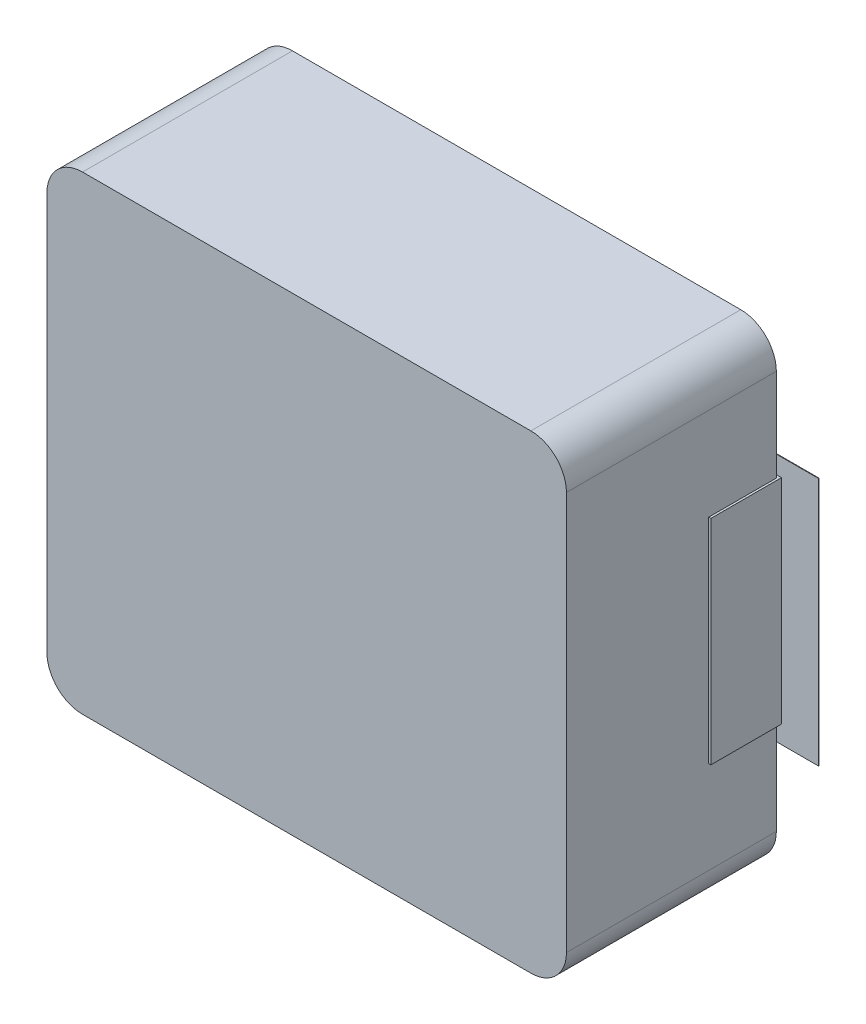
ISO-10303-21;
HEADER;
FILE_DESCRIPTION(('STEP AP214'),'2;1');
FILE_NAME('part.step','',(''),(''),'','','');
FILE_SCHEMA(('AUTOMOTIVE_DESIGN { 1 0 10303 214 1 1 1 1 }'));
ENDSEC;
DATA;
#1=APPLICATION_CONTEXT('core data for automotive mechanical design processes');
#2=APPLICATION_PROTOCOL_DEFINITION('international standard','automotive_design',2000,#1);
#3=PRODUCT_CONTEXT('',#1,'mechanical');
#4=PRODUCT('Part','Part','',(#3));
#5=PRODUCT_RELATED_PRODUCT_CATEGORY('part','',(#4));
#6=PRODUCT_DEFINITION_FORMATION('','',#4);
#7=PRODUCT_DEFINITION_CONTEXT('part definition',#1,'design');
#8=PRODUCT_DEFINITION('design','',#6,#7);
#9=PRODUCT_DEFINITION_SHAPE('','',#8);
#10=(LENGTH_UNIT() NAMED_UNIT(*) SI_UNIT(.MILLI.,.METRE.));
#11=(NAMED_UNIT(*) PLANE_ANGLE_UNIT() SI_UNIT($,.RADIAN.));
#12=(NAMED_UNIT(*) SI_UNIT($,.STERADIAN.) SOLID_ANGLE_UNIT());
#13=UNCERTAINTY_MEASURE_WITH_UNIT(LENGTH_MEASURE(1.E-05),#10,'distance_accuracy_value','');
#14=(GEOMETRIC_REPRESENTATION_CONTEXT(3) GLOBAL_UNCERTAINTY_ASSIGNED_CONTEXT((#13)) GLOBAL_UNIT_ASSIGNED_CONTEXT((#10,
#11,#12)) REPRESENTATION_CONTEXT('',''));
#15=CARTESIAN_POINT('',(0.,0.,0.));
#16=DIRECTION('',(0.,0.,1.));
#17=DIRECTION('',(1.,0.,0.));
#18=AXIS2_PLACEMENT_3D('',#15,#16,#17);
#19=CARTESIAN_POINT('',(0.,0.,0.0762));
#20=DIRECTION('',(0.,0.,1.));
#21=DIRECTION('',(1.,0.,0.));
#22=AXIS2_PLACEMENT_3D('',#19,#20,#21);
#23=PLANE('',#22);
#24=DIRECTION('',(1.,0.,0.));
#25=VECTOR('',#24,1.);
#26=CARTESIAN_POINT('',(-1.25000000000008,1.75000000000011,0.0762));
#27=LINE('',#26,#25);
#28=CARTESIAN_POINT('',(-1.25000000000008,1.75000000000011,0.0762));
#29=VERTEX_POINT('',#28);
#30=CARTESIAN_POINT('',(-4.20000000000098,1.75000000000011,0.0762));
#31=VERTEX_POINT('',#30);
#32=EDGE_CURVE('E199',#29,#31,#27,.F.);
#33=ORIENTED_EDGE('',*,*,#32,.F.);
#34=DIRECTION('',(0.,1.,0.));
#35=VECTOR('',#34,1.);
#36=CARTESIAN_POINT('',(-1.25000000000008,-1.75000000000011,0.0762));
#37=LINE('',#36,#35);
#38=CARTESIAN_POINT('',(-1.25000000000008,-1.75000000000011,0.0762));
#39=VERTEX_POINT('',#38);
#40=EDGE_CURVE('E204',#39,#29,#37,.T.);
#41=ORIENTED_EDGE('',*,*,#40,.F.);
#42=DIRECTION('',(1.,0.,0.));
#43=VECTOR('',#42,1.);
#44=CARTESIAN_POINT('',(-4.20000000000098,-1.75000000000011,0.0762));
#45=LINE('',#44,#43);
#46=CARTESIAN_POINT('',(-4.20000000000098,-1.75000000000011,0.0762));
#47=VERTEX_POINT('',#46);
#48=EDGE_CURVE('E296',#47,#39,#45,.T.);
#49=ORIENTED_EDGE('',*,*,#48,.F.);
#50=DIRECTION('',(0.,1.,0.));
#51=VECTOR('',#50,1.);
#52=CARTESIAN_POINT('',(-4.20000000000098,1.75000000000011,0.0762));
#53=LINE('',#52,#51);
#54=EDGE_CURVE('E214',#31,#47,#53,.F.);
#55=ORIENTED_EDGE('',*,*,#54,.F.);
#56=EDGE_LOOP('',(#33,#41,#49,#55));
#57=FACE_BOUND('',#56,.T.);
#58=ADVANCED_FACE('F17',(#57),#23,.F.);
#59=CARTESIAN_POINT('',(0.,0.,0.0762));
#60=DIRECTION('',(0.,0.,1.));
#61=DIRECTION('',(1.,0.,0.));
#62=AXIS2_PLACEMENT_3D('',#59,#60,#61);
#63=PLANE('',#62);
#64=DIRECTION('',(1.,0.,0.));
#65=VECTOR('',#64,1.);
#66=CARTESIAN_POINT('',(4.20000000000098,1.75000000000011,0.0762));
#67=LINE('',#66,#65);
#68=CARTESIAN_POINT('',(4.20000000000098,1.75000000000011,0.0762));
#69=VERTEX_POINT('',#68);
#70=CARTESIAN_POINT('',(1.25000000000008,1.75000000000011,0.0762));
#71=VERTEX_POINT('',#70);
#72=EDGE_CURVE('E289',#69,#71,#67,.F.);
#73=ORIENTED_EDGE('',*,*,#72,.F.);
#74=DIRECTION('',(0.,1.,0.));
#75=VECTOR('',#74,1.);
#76=CARTESIAN_POINT('',(4.20000000000098,-1.75000000000011,0.0762));
#77=LINE('',#76,#75);
#78=CARTESIAN_POINT('',(4.20000000000098,-1.75000000000011,0.0762));
#79=VERTEX_POINT('',#78);
#80=EDGE_CURVE('E294',#79,#69,#77,.T.);
#81=ORIENTED_EDGE('',*,*,#80,.F.);
#82=DIRECTION('',(1.,0.,0.));
#83=VECTOR('',#82,1.);
#84=CARTESIAN_POINT('',(1.25000000000008,-1.75000000000011,0.0762));
#85=LINE('',#84,#83);
#86=CARTESIAN_POINT('',(1.25000000000008,-1.75000000000011,0.0762));
#87=VERTEX_POINT('',#86);
#88=EDGE_CURVE('E274',#87,#79,#85,.T.);
#89=ORIENTED_EDGE('',*,*,#88,.F.);
#90=DIRECTION('',(0.,1.,0.));
#91=VECTOR('',#90,1.);
#92=CARTESIAN_POINT('',(1.25000000000008,1.75000000000011,0.0762));
#93=LINE('',#92,#91);
#94=EDGE_CURVE('E284',#71,#87,#93,.F.);
#95=ORIENTED_EDGE('',*,*,#94,.F.);
#96=EDGE_LOOP('',(#73,#81,#89,#95));
#97=FACE_BOUND('',#96,.T.);
#98=ADVANCED_FACE('F638',(#97),#63,.F.);
#99=CARTESIAN_POINT('',(-1.25000000000008,-1.75000000000011,0.0762));
#100=DIRECTION('',(1.,0.,0.));
#101=DIRECTION('',(0.,0.,-1.));
#102=AXIS2_PLACEMENT_3D('',#99,#100,#101);
#103=PLANE('',#102);
#104=DIRECTION('',(0.,0.,-1.));
#105=VECTOR('',#104,1.);
#106=CARTESIAN_POINT('',(-1.25000000000008,-1.75000000000011,0.0762));
#107=LINE('',#106,#105);
#108=CARTESIAN_POINT('',(-1.25000000000008,-1.75000000000011,0.0841999999999934));
#109=VERTEX_POINT('',#108);
#110=EDGE_CURVE('E209',#39,#109,#107,.F.);
#111=ORIENTED_EDGE('',*,*,#110,.F.);
#112=ORIENTED_EDGE('',*,*,#40,.T.);
#113=DIRECTION('',(0.,0.,1.));
#114=VECTOR('',#113,1.);
#115=CARTESIAN_POINT('',(-1.25000000000008,1.75000000000011,0.0762));
#116=LINE('',#115,#114);
#117=CARTESIAN_POINT('',(-1.25000000000008,1.75000000000011,0.0841999999999934));
#118=VERTEX_POINT('',#117);
#119=EDGE_CURVE('E206',#118,#29,#116,.F.);
#120=ORIENTED_EDGE('',*,*,#119,.F.);
#121=DIRECTION('',(0.,1.,0.));
#122=VECTOR('',#121,1.);
#123=CARTESIAN_POINT('',(-1.25000000000008,0.,0.0841999999999934));
#124=LINE('',#123,#122);
#125=EDGE_CURVE('E277',#109,#118,#124,.T.);
#126=ORIENTED_EDGE('',*,*,#125,.F.);
#127=EDGE_LOOP('',(#111,#112,#120,#126));
#128=FACE_BOUND('',#127,.T.);
#129=ADVANCED_FACE('F205',(#128),#103,.T.);
#130=CARTESIAN_POINT('',(-1.25000000000008,1.75000000000011,0.0762));
#131=DIRECTION('',(0.,1.,0.));
#132=DIRECTION('',(0.,0.,1.));
#133=AXIS2_PLACEMENT_3D('',#130,#131,#132);
#134=PLANE('',#133);
#135=ORIENTED_EDGE('',*,*,#119,.T.);
#136=ORIENTED_EDGE('',*,*,#32,.T.);
#137=DIRECTION('',(0.,0.,1.));
#138=VECTOR('',#137,1.);
#139=CARTESIAN_POINT('',(-4.20000000000098,1.75000000000011,0.0762));
#140=LINE('',#139,#138);
#141=CARTESIAN_POINT('',(-4.20000000000098,1.75000000000011,0.0841999999999934));
#142=VERTEX_POINT('',#141);
#143=EDGE_CURVE('E216',#142,#31,#140,.F.);
#144=ORIENTED_EDGE('',*,*,#143,.F.);
#145=DIRECTION('',(1.,0.,0.));
#146=VECTOR('',#145,1.);
#147=CARTESIAN_POINT('',(0.,1.75000000000011,0.0841999999999934));
#148=LINE('',#147,#146);
#149=EDGE_CURVE('E220',#118,#142,#148,.F.);
#150=ORIENTED_EDGE('',*,*,#149,.F.);
#151=EDGE_LOOP('',(#135,#136,#144,#150));
#152=FACE_BOUND('',#151,.T.);
#153=ADVANCED_FACE('F218',(#152),#134,.T.);
#154=CARTESIAN_POINT('',(-4.20000000000098,1.75000000000011,0.0762));
#155=DIRECTION('',(-1.,0.,0.));
#156=DIRECTION('',(0.,0.,1.));
#157=AXIS2_PLACEMENT_3D('',#154,#155,#156);
#158=PLANE('',#157);
#159=ORIENTED_EDGE('',*,*,#143,.T.);
#160=ORIENTED_EDGE('',*,*,#54,.T.);
#161=DIRECTION('',(0.,0.,-1.));
#162=VECTOR('',#161,1.);
#163=CARTESIAN_POINT('',(-4.20000000000098,-1.75000000000011,0.0762));
#164=LINE('',#163,#162);
#165=CARTESIAN_POINT('',(-4.20000000000098,-1.75000000000011,0.0841999999999934));
#166=VERTEX_POINT('',#165);
#167=EDGE_CURVE('E298',#166,#47,#164,.T.);
#168=ORIENTED_EDGE('',*,*,#167,.F.);
#169=DIRECTION('',(0.,1.,0.));
#170=VECTOR('',#169,1.);
#171=CARTESIAN_POINT('',(-4.20000000000098,0.,0.0841999999999934));
#172=LINE('',#171,#170);
#173=EDGE_CURVE('E306',#142,#166,#172,.F.);
#174=ORIENTED_EDGE('',*,*,#173,.F.);
#175=EDGE_LOOP('',(#159,#160,#168,#174));
#176=FACE_BOUND('',#175,.T.);
#177=ADVANCED_FACE('F304',(#176),#158,.T.);
#178=CARTESIAN_POINT('',(-4.20000000000098,-1.75000000000011,0.0762));
#179=DIRECTION('',(0.,-1.,0.));
#180=DIRECTION('',(0.,0.,-1.));
#181=AXIS2_PLACEMENT_3D('',#178,#179,#180);
#182=PLANE('',#181);
#183=ORIENTED_EDGE('',*,*,#167,.T.);
#184=ORIENTED_EDGE('',*,*,#48,.T.);
#185=ORIENTED_EDGE('',*,*,#110,.T.);
#186=DIRECTION('',(1.,0.,0.));
#187=VECTOR('',#186,1.);
#188=CARTESIAN_POINT('',(0.,-1.75000000000011,0.0841999999999934));
#189=LINE('',#188,#187);
#190=EDGE_CURVE('E310',#166,#109,#189,.T.);
#191=ORIENTED_EDGE('',*,*,#190,.F.);
#192=EDGE_LOOP('',(#183,#184,#185,#191));
#193=FACE_BOUND('',#192,.T.);
#194=ADVANCED_FACE('F422',(#193),#182,.T.);
#195=CARTESIAN_POINT('',(4.20000000000098,-1.75000000000011,0.0762));
#196=DIRECTION('',(1.,0.,0.));
#197=DIRECTION('',(0.,0.,-1.));
#198=AXIS2_PLACEMENT_3D('',#195,#196,#197);
#199=PLANE('',#198);
#200=DIRECTION('',(0.,0.,-1.));
#201=VECTOR('',#200,1.);
#202=CARTESIAN_POINT('',(4.20000000000098,-1.75000000000011,0.0762));
#203=LINE('',#202,#201);
#204=CARTESIAN_POINT('',(4.20000000000098,-1.75000000000011,0.0841999999999934));
#205=VERTEX_POINT('',#204);
#206=EDGE_CURVE('E281',#79,#205,#203,.F.);
#207=ORIENTED_EDGE('',*,*,#206,.F.);
#208=ORIENTED_EDGE('',*,*,#80,.T.);
#209=DIRECTION('',(0.,0.,1.));
#210=VECTOR('',#209,1.);
#211=CARTESIAN_POINT('',(4.20000000000098,1.75000000000011,0.0762));
#212=LINE('',#211,#210);
#213=CARTESIAN_POINT('',(4.20000000000098,1.75000000000011,0.0841999999999934));
#214=VERTEX_POINT('',#213);
#215=EDGE_CURVE('E291',#214,#69,#212,.F.);
#216=ORIENTED_EDGE('',*,*,#215,.F.);
#217=DIRECTION('',(0.,1.,0.));
#218=VECTOR('',#217,1.);
#219=CARTESIAN_POINT('',(4.20000000000098,0.,0.0841999999999934));
#220=LINE('',#219,#218);
#221=EDGE_CURVE('E390',#205,#214,#220,.T.);
#222=ORIENTED_EDGE('',*,*,#221,.F.);
#223=EDGE_LOOP('',(#207,#208,#216,#222));
#224=FACE_BOUND('',#223,.T.);
#225=ADVANCED_FACE('F424',(#224),#199,.T.);
#226=CARTESIAN_POINT('',(4.20000000000098,1.75000000000011,0.0762));
#227=DIRECTION('',(0.,1.,0.));
#228=DIRECTION('',(0.,0.,1.));
#229=AXIS2_PLACEMENT_3D('',#226,#227,#228);
#230=PLANE('',#229);
#231=ORIENTED_EDGE('',*,*,#215,.T.);
#232=ORIENTED_EDGE('',*,*,#72,.T.);
#233=DIRECTION('',(0.,0.,1.));
#234=VECTOR('',#233,1.);
#235=CARTESIAN_POINT('',(1.25000000000008,1.75000000000011,0.0762));
#236=LINE('',#235,#234);
#237=CARTESIAN_POINT('',(1.25000000000008,1.75000000000011,0.0841999999999934));
#238=VERTEX_POINT('',#237);
#239=EDGE_CURVE('E286',#238,#71,#236,.F.);
#240=ORIENTED_EDGE('',*,*,#239,.F.);
#241=DIRECTION('',(1.,0.,0.));
#242=VECTOR('',#241,1.);
#243=CARTESIAN_POINT('',(0.,1.75000000000011,0.0841999999999934));
#244=LINE('',#243,#242);
#245=EDGE_CURVE('E387',#214,#238,#244,.F.);
#246=ORIENTED_EDGE('',*,*,#245,.F.);
#247=EDGE_LOOP('',(#231,#232,#240,#246));
#248=FACE_BOUND('',#247,.T.);
#249=ADVANCED_FACE('F431',(#248),#230,.T.);
#250=CARTESIAN_POINT('',(1.25000000000008,1.75000000000011,0.0762));
#251=DIRECTION('',(-1.,0.,0.));
#252=DIRECTION('',(0.,0.,1.));
#253=AXIS2_PLACEMENT_3D('',#250,#251,#252);
#254=PLANE('',#253);
#255=ORIENTED_EDGE('',*,*,#239,.T.);
#256=ORIENTED_EDGE('',*,*,#94,.T.);
#257=DIRECTION('',(0.,0.,-1.));
#258=VECTOR('',#257,1.);
#259=CARTESIAN_POINT('',(1.25000000000008,-1.75000000000011,0.0762));
#260=LINE('',#259,#258);
#261=CARTESIAN_POINT('',(1.25000000000008,-1.75000000000011,0.0841999999999934));
#262=VERTEX_POINT('',#261);
#263=EDGE_CURVE('E278',#262,#87,#260,.T.);
#264=ORIENTED_EDGE('',*,*,#263,.F.);
#265=DIRECTION('',(0.,1.,0.));
#266=VECTOR('',#265,1.);
#267=CARTESIAN_POINT('',(1.25000000000008,0.,0.0841999999999934));
#268=LINE('',#267,#266);
#269=EDGE_CURVE('E384',#238,#262,#268,.F.);
#270=ORIENTED_EDGE('',*,*,#269,.F.);
#271=EDGE_LOOP('',(#255,#256,#264,#270));
#272=FACE_BOUND('',#271,.T.);
#273=ADVANCED_FACE('F520',(#272),#254,.T.);
#274=CARTESIAN_POINT('',(1.25000000000008,-1.75000000000011,0.0762));
#275=DIRECTION('',(0.,-1.,0.));
#276=DIRECTION('',(0.,0.,-1.));
#277=AXIS2_PLACEMENT_3D('',#274,#275,#276);
#278=PLANE('',#277);
#279=ORIENTED_EDGE('',*,*,#263,.T.);
#280=ORIENTED_EDGE('',*,*,#88,.T.);
#281=ORIENTED_EDGE('',*,*,#206,.T.);
#282=DIRECTION('',(1.,0.,0.));
#283=VECTOR('',#282,1.);
#284=CARTESIAN_POINT('',(0.,-1.75000000000011,0.0841999999999934));
#285=LINE('',#284,#283);
#286=EDGE_CURVE('E381',#262,#205,#285,.T.);
#287=ORIENTED_EDGE('',*,*,#286,.F.);
#288=EDGE_LOOP('',(#279,#280,#281,#287));
#289=FACE_BOUND('',#288,.T.);
#290=ADVANCED_FACE('F516',(#289),#278,.T.);
#291=CARTESIAN_POINT('',(0.,0.,0.0841999999999934));
#292=DIRECTION('',(0.,0.,1.));
#293=DIRECTION('',(1.,0.,0.));
#294=AXIS2_PLACEMENT_3D('',#291,#292,#293);
#295=PLANE('',#294);
#296=DIRECTION('',(0.,1.,0.));
#297=VECTOR('',#296,1.);
#298=CARTESIAN_POINT('',(-1.8800000000001,-1.5000000000001,0.0841999999999934));
#299=LINE('',#298,#297);
#300=CARTESIAN_POINT('',(-1.8800000000001,-1.5000000000001,0.0841999999999934));
#301=VERTEX_POINT('',#300);
#302=CARTESIAN_POINT('',(-1.8800000000001,1.5000000000001,0.0841999999999934));
#303=VERTEX_POINT('',#302);
#304=EDGE_CURVE('E328',#301,#303,#299,.T.);
#305=ORIENTED_EDGE('',*,*,#304,.F.);
#306=DIRECTION('',(1.,0.,0.));
#307=VECTOR('',#306,1.);
#308=CARTESIAN_POINT('',(-3.68000000000052,-1.5000000000001,0.0841999999999934));
#309=LINE('',#308,#307);
#310=CARTESIAN_POINT('',(-3.68000000000052,-1.5000000000001,0.0841999999999934));
#311=VERTEX_POINT('',#310);
#312=EDGE_CURVE('E270',#311,#301,#309,.T.);
#313=ORIENTED_EDGE('',*,*,#312,.F.);
#314=DIRECTION('',(0.,1.,0.));
#315=VECTOR('',#314,1.);
#316=CARTESIAN_POINT('',(-3.68000000000052,1.5000000000001,0.0841999999999934));
#317=LINE('',#316,#315);
#318=CARTESIAN_POINT('',(-3.68000000000052,1.5000000000001,0.0841999999999934));
#319=VERTEX_POINT('',#318);
#320=EDGE_CURVE('E353',#319,#311,#317,.F.);
#321=ORIENTED_EDGE('',*,*,#320,.F.);
#322=DIRECTION('',(1.,0.,0.));
#323=VECTOR('',#322,1.);
#324=CARTESIAN_POINT('',(-1.8800000000001,1.5000000000001,0.0841999999999934));
#325=LINE('',#324,#323);
#326=EDGE_CURVE('E340',#303,#319,#325,.F.);
#327=ORIENTED_EDGE('',*,*,#326,.F.);
#328=EDGE_LOOP('',(#305,#313,#321,#327));
#329=FACE_BOUND('',#328,.T.);
#330=ORIENTED_EDGE('',*,*,#173,.T.);
#331=ORIENTED_EDGE('',*,*,#190,.T.);
#332=ORIENTED_EDGE('',*,*,#125,.T.);
#333=ORIENTED_EDGE('',*,*,#149,.T.);
#334=EDGE_LOOP('',(#330,#331,#332,#333));
#335=FACE_BOUND('',#334,.T.);
#336=ADVANCED_FACE('F312',(#329,#335),#295,.T.);
#337=CARTESIAN_POINT('',(0.,0.,0.0841999999999934));
#338=DIRECTION('',(0.,0.,1.));
#339=DIRECTION('',(1.,0.,0.));
#340=AXIS2_PLACEMENT_3D('',#337,#338,#339);
#341=PLANE('',#340);
#342=DIRECTION('',(1.,0.,0.));
#343=VECTOR('',#342,1.);
#344=CARTESIAN_POINT('',(3.68000000000052,1.5000000000001,0.0841999999999934));
#345=LINE('',#344,#343);
#346=CARTESIAN_POINT('',(3.68000000000052,1.5000000000001,0.0841999999999934));
#347=VERTEX_POINT('',#346);
#348=CARTESIAN_POINT('',(1.8800000000001,1.5000000000001,0.0841999999999934));
#349=VERTEX_POINT('',#348);
#350=EDGE_CURVE('E348',#347,#349,#345,.F.);
#351=ORIENTED_EDGE('',*,*,#350,.F.);
#352=DIRECTION('',(0.,1.,0.));
#353=VECTOR('',#352,1.);
#354=CARTESIAN_POINT('',(3.68000000000052,-1.5000000000001,0.0841999999999934));
#355=LINE('',#354,#353);
#356=CARTESIAN_POINT('',(3.68000000000052,-1.5000000000001,0.0841999999999934));
#357=VERTEX_POINT('',#356);
#358=EDGE_CURVE('E356',#357,#347,#355,.T.);
#359=ORIENTED_EDGE('',*,*,#358,.F.);
#360=DIRECTION('',(1.,0.,0.));
#361=VECTOR('',#360,1.);
#362=CARTESIAN_POINT('',(1.8800000000001,-1.5000000000001,0.0841999999999934));
#363=LINE('',#362,#361);
#364=CARTESIAN_POINT('',(1.8800000000001,-1.5000000000001,0.0841999999999934));
#365=VERTEX_POINT('',#364);
#366=EDGE_CURVE('E399',#365,#357,#363,.T.);
#367=ORIENTED_EDGE('',*,*,#366,.F.);
#368=DIRECTION('',(0.,1.,0.));
#369=VECTOR('',#368,1.);
#370=CARTESIAN_POINT('',(1.8800000000001,1.5000000000001,0.0841999999999934));
#371=LINE('',#370,#369);
#372=EDGE_CURVE('E377',#349,#365,#371,.F.);
#373=ORIENTED_EDGE('',*,*,#372,.F.);
#374=EDGE_LOOP('',(#351,#359,#367,#373));
#375=FACE_BOUND('',#374,.T.);
#376=ORIENTED_EDGE('',*,*,#269,.T.);
#377=ORIENTED_EDGE('',*,*,#286,.T.);
#378=ORIENTED_EDGE('',*,*,#221,.T.);
#379=ORIENTED_EDGE('',*,*,#245,.T.);
#380=EDGE_LOOP('',(#376,#377,#378,#379));
#381=FACE_BOUND('',#380,.T.);
#382=ADVANCED_FACE('F509',(#375,#381),#341,.T.);
#383=CARTESIAN_POINT('',(3.68000000000052,-1.5000000000001,0.0762));
#384=DIRECTION('',(1.,0.,0.));
#385=DIRECTION('',(0.,0.,-1.));
#386=AXIS2_PLACEMENT_3D('',#383,#384,#385);
#387=PLANE('',#386);
#388=DIRECTION('',(0.,0.,-1.));
#389=VECTOR('',#388,1.);
#390=CARTESIAN_POINT('',(3.68000000000052,-1.5000000000001,0.0762));
#391=LINE('',#390,#389);
#392=CARTESIAN_POINT('',(3.68000000000052,-1.5000000000001,1.07620000000006));
#393=VERTEX_POINT('',#392);
#394=EDGE_CURVE('E337',#357,#393,#391,.F.);
#395=ORIENTED_EDGE('',*,*,#394,.F.);
#396=ORIENTED_EDGE('',*,*,#358,.T.);
#397=DIRECTION('',(0.,0.,1.));
#398=VECTOR('',#397,1.);
#399=CARTESIAN_POINT('',(3.68000000000052,1.5000000000001,0.0762));
#400=LINE('',#399,#398);
#401=CARTESIAN_POINT('',(3.68000000000052,1.5000000000001,1.07620000000006));
#402=VERTEX_POINT('',#401);
#403=EDGE_CURVE('E362',#402,#347,#400,.F.);
#404=ORIENTED_EDGE('',*,*,#403,.F.);
#405=DIRECTION('',(0.,1.,0.));
#406=VECTOR('',#405,1.);
#407=CARTESIAN_POINT('',(3.68000000000052,0.,1.07620000000006));
#408=LINE('',#407,#406);
#409=EDGE_CURVE('E252',#393,#402,#408,.T.);
#410=ORIENTED_EDGE('',*,*,#409,.F.);
#411=EDGE_LOOP('',(#395,#396,#404,#410));
#412=FACE_BOUND('',#411,.T.);
#413=ADVANCED_FACE('F505',(#412),#387,.T.);
#414=CARTESIAN_POINT('',(-3.68000000000052,1.5000000000001,0.0762));
#415=DIRECTION('',(-1.,0.,0.));
#416=DIRECTION('',(0.,0.,1.));
#417=AXIS2_PLACEMENT_3D('',#414,#415,#416);
#418=PLANE('',#417);
#419=DIRECTION('',(0.,0.,1.));
#420=VECTOR('',#419,1.);
#421=CARTESIAN_POINT('',(-3.68000000000052,1.5000000000001,0.0762));
#422=LINE('',#421,#420);
#423=CARTESIAN_POINT('',(-3.68000000000052,1.5000000000001,1.07620000000006));
#424=VERTEX_POINT('',#423);
#425=EDGE_CURVE('E346',#319,#424,#422,.T.);
#426=ORIENTED_EDGE('',*,*,#425,.F.);
#427=ORIENTED_EDGE('',*,*,#320,.T.);
#428=DIRECTION('',(0.,0.,-1.));
#429=VECTOR('',#428,1.);
#430=CARTESIAN_POINT('',(-3.68000000000052,-1.5000000000001,0.0762));
#431=LINE('',#430,#429);
#432=CARTESIAN_POINT('',(-3.68000000000052,-1.5000000000001,1.07620000000006));
#433=VERTEX_POINT('',#432);
#434=EDGE_CURVE('E267',#433,#311,#431,.T.);
#435=ORIENTED_EDGE('',*,*,#434,.F.);
#436=DIRECTION('',(0.,1.,0.));
#437=VECTOR('',#436,1.);
#438=CARTESIAN_POINT('',(-3.68000000000052,0.,1.07620000000006));
#439=LINE('',#438,#437);
#440=EDGE_CURVE('E248',#424,#433,#439,.F.);
#441=ORIENTED_EDGE('',*,*,#440,.F.);
#442=EDGE_LOOP('',(#426,#427,#435,#441));
#443=FACE_BOUND('',#442,.T.);
#444=ADVANCED_FACE('F502',(#443),#418,.T.);
#445=CARTESIAN_POINT('',(3.68000000000052,1.5000000000001,0.0762));
#446=DIRECTION('',(0.,1.,0.));
#447=DIRECTION('',(0.,0.,1.));
#448=AXIS2_PLACEMENT_3D('',#445,#446,#447);
#449=PLANE('',#448);
#450=ORIENTED_EDGE('',*,*,#403,.T.);
#451=ORIENTED_EDGE('',*,*,#350,.T.);
#452=DIRECTION('',(0.,0.,1.));
#453=VECTOR('',#452,1.);
#454=CARTESIAN_POINT('',(1.8800000000001,1.5000000000001,0.0762));
#455=LINE('',#454,#453);
#456=CARTESIAN_POINT('',(1.8800000000001,1.5000000000001,0.126200000000003));
#457=VERTEX_POINT('',#456);
#458=EDGE_CURVE('E374',#457,#349,#455,.F.);
#459=ORIENTED_EDGE('',*,*,#458,.F.);
#460=DIRECTION('',(1.,0.,0.));
#461=VECTOR('',#460,1.);
#462=CARTESIAN_POINT('',(0.,1.5000000000001,0.126200000000003));
#463=LINE('',#462,#461);
#464=CARTESIAN_POINT('',(3.65000000000064,1.5000000000001,0.126200000000003));
#465=VERTEX_POINT('',#464);
#466=EDGE_CURVE('E238',#457,#465,#463,.T.);
#467=ORIENTED_EDGE('',*,*,#466,.T.);
#468=DIRECTION('',(0.,0.,1.));
#469=VECTOR('',#468,1.);
#470=CARTESIAN_POINT('',(3.65000000000064,1.5000000000001,0.0762));
#471=LINE('',#470,#469);
#472=CARTESIAN_POINT('',(3.65000000000064,1.5000000000001,1.07620000000006));
#473=VERTEX_POINT('',#472);
#474=EDGE_CURVE('E355',#465,#473,#471,.T.);
#475=ORIENTED_EDGE('',*,*,#474,.T.);
#476=DIRECTION('',(1.,0.,0.));
#477=VECTOR('',#476,1.);
#478=CARTESIAN_POINT('',(0.,1.5000000000001,1.07620000000006));
#479=LINE('',#478,#477);
#480=EDGE_CURVE('E250',#402,#473,#479,.F.);
#481=ORIENTED_EDGE('',*,*,#480,.F.);
#482=EDGE_LOOP('',(#450,#451,#459,#467,#475,#481));
#483=FACE_BOUND('',#482,.T.);
#484=ADVANCED_FACE('F498',(#483),#449,.T.);
#485=CARTESIAN_POINT('',(-1.8800000000001,1.5000000000001,0.0762));
#486=DIRECTION('',(0.,1.,0.));
#487=DIRECTION('',(0.,0.,1.));
#488=AXIS2_PLACEMENT_3D('',#485,#486,#487);
#489=PLANE('',#488);
#490=DIRECTION('',(0.,0.,-1.));
#491=VECTOR('',#490,1.);
#492=CARTESIAN_POINT('',(-1.8800000000001,1.5000000000001,0.0762));
#493=LINE('',#492,#491);
#494=CARTESIAN_POINT('',(-1.8800000000001,1.5000000000001,0.126200000000003));
#495=VERTEX_POINT('',#494);
#496=EDGE_CURVE('E332',#303,#495,#493,.F.);
#497=ORIENTED_EDGE('',*,*,#496,.F.);
#498=ORIENTED_EDGE('',*,*,#326,.T.);
#499=ORIENTED_EDGE('',*,*,#425,.T.);
#500=DIRECTION('',(1.,0.,0.));
#501=VECTOR('',#500,1.);
#502=CARTESIAN_POINT('',(0.,1.5000000000001,1.07620000000006));
#503=LINE('',#502,#501);
#504=CARTESIAN_POINT('',(-3.65000000000064,1.5000000000001,1.07620000000006));
#505=VERTEX_POINT('',#504);
#506=EDGE_CURVE('E242',#505,#424,#503,.F.);
#507=ORIENTED_EDGE('',*,*,#506,.F.);
#508=DIRECTION('',(0.,0.,1.));
#509=VECTOR('',#508,1.);
#510=CARTESIAN_POINT('',(-3.65000000000064,1.5000000000001,0.0762));
#511=LINE('',#510,#509);
#512=CARTESIAN_POINT('',(-3.65000000000064,1.5000000000001,0.126200000000003));
#513=VERTEX_POINT('',#512);
#514=EDGE_CURVE('E343',#505,#513,#511,.F.);
#515=ORIENTED_EDGE('',*,*,#514,.T.);
#516=DIRECTION('',(1.,0.,0.));
#517=VECTOR('',#516,1.);
#518=CARTESIAN_POINT('',(0.,1.5000000000001,0.126200000000003));
#519=LINE('',#518,#517);
#520=EDGE_CURVE('E235',#513,#495,#519,.T.);
#521=ORIENTED_EDGE('',*,*,#520,.T.);
#522=EDGE_LOOP('',(#497,#498,#499,#507,#515,#521));
#523=FACE_BOUND('',#522,.T.);
#524=ADVANCED_FACE('F494',(#523),#489,.T.);
#525=CARTESIAN_POINT('',(-1.8800000000001,-1.5000000000001,0.0762));
#526=DIRECTION('',(1.,0.,0.));
#527=DIRECTION('',(0.,0.,-1.));
#528=AXIS2_PLACEMENT_3D('',#525,#526,#527);
#529=PLANE('',#528);
#530=DIRECTION('',(0.,0.,-1.));
#531=VECTOR('',#530,1.);
#532=CARTESIAN_POINT('',(-1.8800000000001,-1.5000000000001,0.0762));
#533=LINE('',#532,#531);
#534=CARTESIAN_POINT('',(-1.8800000000001,-1.5000000000001,0.126200000000003));
#535=VERTEX_POINT('',#534);
#536=EDGE_CURVE('E331',#301,#535,#533,.F.);
#537=ORIENTED_EDGE('',*,*,#536,.F.);
#538=ORIENTED_EDGE('',*,*,#304,.T.);
#539=ORIENTED_EDGE('',*,*,#496,.T.);
#540=DIRECTION('',(0.,1.,0.));
#541=VECTOR('',#540,1.);
#542=CARTESIAN_POINT('',(-1.8800000000001,0.,0.126200000000003));
#543=LINE('',#542,#541);
#544=EDGE_CURVE('E566',#495,#535,#543,.F.);
#545=ORIENTED_EDGE('',*,*,#544,.T.);
#546=EDGE_LOOP('',(#537,#538,#539,#545));
#547=FACE_BOUND('',#546,.T.);
#548=ADVANCED_FACE('F490',(#547),#529,.T.);
#549=CARTESIAN_POINT('',(-3.68000000000052,-1.5000000000001,0.0762));
#550=DIRECTION('',(0.,-1.,0.));
#551=DIRECTION('',(0.,0.,-1.));
#552=AXIS2_PLACEMENT_3D('',#549,#550,#551);
#553=PLANE('',#552);
#554=ORIENTED_EDGE('',*,*,#434,.T.);
#555=ORIENTED_EDGE('',*,*,#312,.T.);
#556=ORIENTED_EDGE('',*,*,#536,.T.);
#557=DIRECTION('',(1.,0.,0.));
#558=VECTOR('',#557,1.);
#559=CARTESIAN_POINT('',(0.,-1.5000000000001,0.126200000000003));
#560=LINE('',#559,#558);
#561=CARTESIAN_POINT('',(-3.65000000000064,-1.5000000000001,0.126200000000003));
#562=VERTEX_POINT('',#561);
#563=EDGE_CURVE('E232',#535,#562,#560,.F.);
#564=ORIENTED_EDGE('',*,*,#563,.T.);
#565=DIRECTION('',(0.,0.,-1.));
#566=VECTOR('',#565,1.);
#567=CARTESIAN_POINT('',(-3.65000000000064,-1.5000000000001,0.0762));
#568=LINE('',#567,#566);
#569=CARTESIAN_POINT('',(-3.65000000000064,-1.5000000000001,1.07620000000006));
#570=VERTEX_POINT('',#569);
#571=EDGE_CURVE('E271',#562,#570,#568,.F.);
#572=ORIENTED_EDGE('',*,*,#571,.T.);
#573=DIRECTION('',(1.,0.,0.));
#574=VECTOR('',#573,1.);
#575=CARTESIAN_POINT('',(0.,-1.5000000000001,1.07620000000006));
#576=LINE('',#575,#574);
#577=EDGE_CURVE('E240',#433,#570,#576,.T.);
#578=ORIENTED_EDGE('',*,*,#577,.F.);
#579=EDGE_LOOP('',(#554,#555,#556,#564,#572,#578));
#580=FACE_BOUND('',#579,.T.);
#581=ADVANCED_FACE('F487',(#580),#553,.T.);
#582=CARTESIAN_POINT('',(1.8800000000001,-1.5000000000001,0.0762));
#583=DIRECTION('',(0.,-1.,0.));
#584=DIRECTION('',(0.,0.,-1.));
#585=AXIS2_PLACEMENT_3D('',#582,#583,#584);
#586=PLANE('',#585);
#587=DIRECTION('',(0.,0.,1.));
#588=VECTOR('',#587,1.);
#589=CARTESIAN_POINT('',(1.8800000000001,-1.5000000000001,0.0762));
#590=LINE('',#589,#588);
#591=CARTESIAN_POINT('',(1.8800000000001,-1.5000000000001,0.126200000000003));
#592=VERTEX_POINT('',#591);
#593=EDGE_CURVE('E378',#365,#592,#590,.T.);
#594=ORIENTED_EDGE('',*,*,#593,.F.);
#595=ORIENTED_EDGE('',*,*,#366,.T.);
#596=ORIENTED_EDGE('',*,*,#394,.T.);
#597=DIRECTION('',(1.,0.,0.));
#598=VECTOR('',#597,1.);
#599=CARTESIAN_POINT('',(0.,-1.5000000000001,1.07620000000006));
#600=LINE('',#599,#598);
#601=CARTESIAN_POINT('',(3.65000000000064,-1.5000000000001,1.07620000000006));
#602=VERTEX_POINT('',#601);
#603=EDGE_CURVE('E259',#602,#393,#600,.T.);
#604=ORIENTED_EDGE('',*,*,#603,.F.);
#605=DIRECTION('',(0.,0.,-1.));
#606=VECTOR('',#605,1.);
#607=CARTESIAN_POINT('',(3.65000000000064,-1.5000000000001,0.0762));
#608=LINE('',#607,#606);
#609=CARTESIAN_POINT('',(3.65000000000064,-1.5000000000001,0.126200000000003));
#610=VERTEX_POINT('',#609);
#611=EDGE_CURVE('E104',#602,#610,#608,.T.);
#612=ORIENTED_EDGE('',*,*,#611,.T.);
#613=DIRECTION('',(1.,0.,0.));
#614=VECTOR('',#613,1.);
#615=CARTESIAN_POINT('',(0.,-1.5000000000001,0.126200000000003));
#616=LINE('',#615,#614);
#617=EDGE_CURVE('E231',#610,#592,#616,.F.);
#618=ORIENTED_EDGE('',*,*,#617,.T.);
#619=EDGE_LOOP('',(#594,#595,#596,#604,#612,#618));
#620=FACE_BOUND('',#619,.T.);
#621=ADVANCED_FACE('F483',(#620),#586,.T.);
#622=CARTESIAN_POINT('',(1.8800000000001,1.5000000000001,0.0762));
#623=DIRECTION('',(-1.,0.,0.));
#624=DIRECTION('',(0.,0.,1.));
#625=AXIS2_PLACEMENT_3D('',#622,#623,#624);
#626=PLANE('',#625);
#627=ORIENTED_EDGE('',*,*,#458,.T.);
#628=ORIENTED_EDGE('',*,*,#372,.T.);
#629=ORIENTED_EDGE('',*,*,#593,.T.);
#630=DIRECTION('',(0.,1.,0.));
#631=VECTOR('',#630,1.);
#632=CARTESIAN_POINT('',(1.8800000000001,0.,0.126200000000003));
#633=LINE('',#632,#631);
#634=EDGE_CURVE('E228',#592,#457,#633,.T.);
#635=ORIENTED_EDGE('',*,*,#634,.T.);
#636=EDGE_LOOP('',(#627,#628,#629,#635));
#637=FACE_BOUND('',#636,.T.);
#638=ADVANCED_FACE('F480',(#637),#626,.T.);
#639=CARTESIAN_POINT('',(0.,0.,1.07620000000006));
#640=DIRECTION('',(0.,0.,1.));
#641=DIRECTION('',(1.,0.,0.));
#642=AXIS2_PLACEMENT_3D('',#639,#640,#641);
#643=PLANE('',#642);
#644=ORIENTED_EDGE('',*,*,#480,.T.);
#645=DIRECTION('',(0.,1.,0.));
#646=VECTOR('',#645,1.);
#647=CARTESIAN_POINT('',(3.65000000000064,-3.2999999999995,1.07620000000006));
#648=LINE('',#647,#646);
#649=EDGE_CURVE('E411',#602,#473,#648,.T.);
#650=ORIENTED_EDGE('',*,*,#649,.F.);
#651=ORIENTED_EDGE('',*,*,#603,.T.);
#652=ORIENTED_EDGE('',*,*,#409,.T.);
#653=EDGE_LOOP('',(#644,#650,#651,#652));
#654=FACE_BOUND('',#653,.T.);
#655=ADVANCED_FACE('F477',(#654),#643,.T.);
#656=CARTESIAN_POINT('',(3.1500000000001,2.79999999999896,6.9869861784));
#657=DIRECTION('',(0.,0.,-1.));
#658=DIRECTION('',(-1.,0.,0.));
#659=AXIS2_PLACEMENT_3D('',#656,#657,#658);
#660=CYLINDRICAL_SURFACE('',#659,0.500000000000032);
#661=DIRECTION('',(0.,0.,-1.));
#662=VECTOR('',#661,1.);
#663=CARTESIAN_POINT('',(3.65000000000064,2.79999999999896,0.0762));
#664=LINE('',#663,#662);
#665=CARTESIAN_POINT('',(3.65000000000064,2.79999999999896,0.126200000000003));
#666=VERTEX_POINT('',#665);
#667=CARTESIAN_POINT('',(3.65000000000064,2.79999999999896,3.076194));
#668=VERTEX_POINT('',#667);
#669=EDGE_CURVE('E617',#666,#668,#664,.F.);
#670=ORIENTED_EDGE('',*,*,#669,.F.);
#671=CARTESIAN_POINT('',(3.1500000000001,2.79999999999896,0.126200000000003));
#672=DIRECTION('',(0.,0.,-1.));
#673=DIRECTION('',(-1.,0.,0.));
#674=AXIS2_PLACEMENT_3D('',#671,#672,#673);
#675=CIRCLE('',#674,0.500000000000032);
#676=CARTESIAN_POINT('',(3.1500000000001,3.2999999999995,0.126200000000003));
#677=VERTEX_POINT('',#676);
#678=EDGE_CURVE('E236',#666,#677,#675,.F.);
#679=ORIENTED_EDGE('',*,*,#678,.T.);
#680=DIRECTION('',(0.,0.,1.));
#681=VECTOR('',#680,1.);
#682=CARTESIAN_POINT('',(3.1500000000001,3.2999999999995,0.0762));
#683=LINE('',#682,#681);
#684=CARTESIAN_POINT('',(3.1500000000001,3.2999999999995,3.076194));
#685=VERTEX_POINT('',#684);
#686=EDGE_CURVE('E413',#685,#677,#683,.F.);
#687=ORIENTED_EDGE('',*,*,#686,.F.);
#688=CARTESIAN_POINT('',(3.1500000000001,2.79999999999896,3.076194));
#689=DIRECTION('',(0.,0.,-1.));
#690=DIRECTION('',(-1.,0.,0.));
#691=AXIS2_PLACEMENT_3D('',#688,#689,#690);
#692=CIRCLE('',#691,0.500000000000032);
#693=EDGE_CURVE('E20',#685,#668,#692,.T.);
#694=ORIENTED_EDGE('',*,*,#693,.T.);
#695=EDGE_LOOP('',(#670,#679,#687,#694));
#696=FACE_BOUND('',#695,.T.);
#697=ADVANCED_FACE('F474',(#696),#660,.T.);
#698=CARTESIAN_POINT('',(-3.1500000000001,2.79999999999896,6.9869861784));
#699=DIRECTION('',(0.,0.,-1.));
#700=DIRECTION('',(-1.,0.,0.));
#701=AXIS2_PLACEMENT_3D('',#698,#699,#700);
#702=CYLINDRICAL_SURFACE('',#701,0.500000000000032);
#703=DIRECTION('',(0.,0.,1.));
#704=VECTOR('',#703,1.);
#705=CARTESIAN_POINT('',(-3.1500000000001,3.2999999999995,0.0762));
#706=LINE('',#705,#704);
#707=CARTESIAN_POINT('',(-3.1500000000001,3.2999999999995,0.126200000000003));
#708=VERTEX_POINT('',#707);
#709=CARTESIAN_POINT('',(-3.1500000000001,3.2999999999995,3.076194));
#710=VERTEX_POINT('',#709);
#711=EDGE_CURVE('E599',#708,#710,#706,.T.);
#712=ORIENTED_EDGE('',*,*,#711,.F.);
#713=CARTESIAN_POINT('',(-3.1500000000001,2.79999999999896,0.126200000000003));
#714=DIRECTION('',(0.,0.,-1.));
#715=DIRECTION('',(-1.,0.,0.));
#716=AXIS2_PLACEMENT_3D('',#713,#714,#715);
#717=CIRCLE('',#716,0.500000000000032);
#718=CARTESIAN_POINT('',(-3.65000000000064,2.79999999999896,0.126200000000003));
#719=VERTEX_POINT('',#718);
#720=EDGE_CURVE('E233',#708,#719,#717,.F.);
#721=ORIENTED_EDGE('',*,*,#720,.T.);
#722=DIRECTION('',(0.,0.,1.));
#723=VECTOR('',#722,1.);
#724=CARTESIAN_POINT('',(-3.65000000000064,2.79999999999896,0.0762));
#725=LINE('',#724,#723);
#726=CARTESIAN_POINT('',(-3.65000000000064,2.79999999999896,3.076194));
#727=VERTEX_POINT('',#726);
#728=EDGE_CURVE('E584',#727,#719,#725,.F.);
#729=ORIENTED_EDGE('',*,*,#728,.F.);
#730=CARTESIAN_POINT('',(-3.1500000000001,2.79999999999896,3.076194));
#731=DIRECTION('',(0.,0.,-1.));
#732=DIRECTION('',(-1.,0.,0.));
#733=AXIS2_PLACEMENT_3D('',#730,#731,#732);
#734=CIRCLE('',#733,0.500000000000032);
#735=EDGE_CURVE('E241',#727,#710,#734,.T.);
#736=ORIENTED_EDGE('',*,*,#735,.T.);
#737=EDGE_LOOP('',(#712,#721,#729,#736));
#738=FACE_BOUND('',#737,.T.);
#739=ADVANCED_FACE('F470',(#738),#702,.T.);
#740=CARTESIAN_POINT('',(0.,0.,1.07620000000006));
#741=DIRECTION('',(0.,0.,1.));
#742=DIRECTION('',(1.,0.,0.));
#743=AXIS2_PLACEMENT_3D('',#740,#741,#742);
#744=PLANE('',#743);
#745=ORIENTED_EDGE('',*,*,#577,.T.);
#746=DIRECTION('',(0.,1.,0.));
#747=VECTOR('',#746,1.);
#748=CARTESIAN_POINT('',(-3.65000000000064,3.2999999999995,1.07620000000006));
#749=LINE('',#748,#747);
#750=EDGE_CURVE('E321',#505,#570,#749,.F.);
#751=ORIENTED_EDGE('',*,*,#750,.F.);
#752=ORIENTED_EDGE('',*,*,#506,.T.);
#753=ORIENTED_EDGE('',*,*,#440,.T.);
#754=EDGE_LOOP('',(#745,#751,#752,#753));
#755=FACE_BOUND('',#754,.T.);
#756=ADVANCED_FACE('F466',(#755),#744,.T.);
#757=CARTESIAN_POINT('',(-3.1500000000001,-2.79999999999896,6.9869861784));
#758=DIRECTION('',(0.,0.,-1.));
#759=DIRECTION('',(-1.,0.,0.));
#760=AXIS2_PLACEMENT_3D('',#757,#758,#759);
#761=CYLINDRICAL_SURFACE('',#760,0.500000000000032);
#762=DIRECTION('',(0.,0.,1.));
#763=VECTOR('',#762,1.);
#764=CARTESIAN_POINT('',(-3.65000000000064,-2.79999999999896,0.0762));
#765=LINE('',#764,#763);
#766=CARTESIAN_POINT('',(-3.65000000000064,-2.79999999999896,0.126200000000003));
#767=VERTEX_POINT('',#766);
#768=CARTESIAN_POINT('',(-3.65000000000064,-2.79999999999896,3.076194));
#769=VERTEX_POINT('',#768);
#770=EDGE_CURVE('E586',#767,#769,#765,.T.);
#771=ORIENTED_EDGE('',*,*,#770,.F.);
#772=CARTESIAN_POINT('',(-3.1500000000001,-2.79999999999896,0.126200000000003));
#773=DIRECTION('',(0.,0.,-1.));
#774=DIRECTION('',(-1.,0.,0.));
#775=AXIS2_PLACEMENT_3D('',#772,#773,#774);
#776=CIRCLE('',#775,0.500000000000032);
#777=CARTESIAN_POINT('',(-3.1500000000001,-3.2999999999995,0.126200000000003));
#778=VERTEX_POINT('',#777);
#779=EDGE_CURVE('E229',#767,#778,#776,.F.);
#780=ORIENTED_EDGE('',*,*,#779,.T.);
#781=DIRECTION('',(0.,0.,-1.));
#782=VECTOR('',#781,1.);
#783=CARTESIAN_POINT('',(-3.1500000000001,-3.2999999999995,0.0762));
#784=LINE('',#783,#782);
#785=CARTESIAN_POINT('',(-3.1500000000001,-3.2999999999995,3.076194));
#786=VERTEX_POINT('',#785);
#787=EDGE_CURVE('E324',#786,#778,#784,.T.);
#788=ORIENTED_EDGE('',*,*,#787,.F.);
#789=CARTESIAN_POINT('',(-3.1500000000001,-2.79999999999896,3.076194));
#790=DIRECTION('',(0.,0.,-1.));
#791=DIRECTION('',(-1.,0.,0.));
#792=AXIS2_PLACEMENT_3D('',#789,#790,#791);
#793=CIRCLE('',#792,0.500000000000032);
#794=EDGE_CURVE('E239',#786,#769,#793,.T.);
#795=ORIENTED_EDGE('',*,*,#794,.T.);
#796=EDGE_LOOP('',(#771,#780,#788,#795));
#797=FACE_BOUND('',#796,.T.);
#798=ADVANCED_FACE('F463',(#797),#761,.T.);
#799=CARTESIAN_POINT('',(0.,0.,0.126200000000003));
#800=DIRECTION('',(0.,0.,1.));
#801=DIRECTION('',(1.,0.,0.));
#802=AXIS2_PLACEMENT_3D('',#799,#800,#801);
#803=PLANE('',#802);
#804=ORIENTED_EDGE('',*,*,#617,.F.);
#805=DIRECTION('',(0.,1.,0.));
#806=VECTOR('',#805,1.);
#807=CARTESIAN_POINT('',(3.65000000000064,-3.2999999999995,0.126200000000003));
#808=LINE('',#807,#806);
#809=CARTESIAN_POINT('',(3.65000000000064,-2.79999999999896,0.126200000000003));
#810=VERTEX_POINT('',#809);
#811=EDGE_CURVE('E414',#810,#610,#808,.T.);
#812=ORIENTED_EDGE('',*,*,#811,.F.);
#813=CARTESIAN_POINT('',(3.1500000000001,-2.79999999999896,0.126200000000003));
#814=DIRECTION('',(0.,0.,-1.));
#815=DIRECTION('',(-1.,0.,0.));
#816=AXIS2_PLACEMENT_3D('',#813,#814,#815);
#817=CIRCLE('',#816,0.500000000000032);
#818=CARTESIAN_POINT('',(3.1500000000001,-3.2999999999995,0.126200000000003));
#819=VERTEX_POINT('',#818);
#820=EDGE_CURVE('E93',#819,#810,#817,.F.);
#821=ORIENTED_EDGE('',*,*,#820,.F.);
#822=DIRECTION('',(1.,0.,0.));
#823=VECTOR('',#822,1.);
#824=CARTESIAN_POINT('',(-3.65000000000064,-3.2999999999995,0.126200000000003));
#825=LINE('',#824,#823);
#826=EDGE_CURVE('E590',#778,#819,#825,.T.);
#827=ORIENTED_EDGE('',*,*,#826,.F.);
#828=ORIENTED_EDGE('',*,*,#779,.F.);
#829=DIRECTION('',(0.,1.,0.));
#830=VECTOR('',#829,1.);
#831=CARTESIAN_POINT('',(-3.65000000000064,3.2999999999995,0.126200000000003));
#832=LINE('',#831,#830);
#833=EDGE_CURVE('E596',#562,#767,#832,.F.);
#834=ORIENTED_EDGE('',*,*,#833,.F.);
#835=ORIENTED_EDGE('',*,*,#563,.F.);
#836=ORIENTED_EDGE('',*,*,#544,.F.);
#837=ORIENTED_EDGE('',*,*,#520,.F.);
#838=DIRECTION('',(0.,1.,0.));
#839=VECTOR('',#838,1.);
#840=CARTESIAN_POINT('',(-3.65000000000064,3.2999999999995,0.126200000000003));
#841=LINE('',#840,#839);
#842=EDGE_CURVE('E325',#719,#513,#841,.F.);
#843=ORIENTED_EDGE('',*,*,#842,.F.);
#844=ORIENTED_EDGE('',*,*,#720,.F.);
#845=DIRECTION('',(1.,0.,0.));
#846=VECTOR('',#845,1.);
#847=CARTESIAN_POINT('',(3.65000000000064,3.2999999999995,0.126200000000003));
#848=LINE('',#847,#846);
#849=EDGE_CURVE('E606',#677,#708,#848,.F.);
#850=ORIENTED_EDGE('',*,*,#849,.F.);
#851=ORIENTED_EDGE('',*,*,#678,.F.);
#852=DIRECTION('',(0.,1.,0.));
#853=VECTOR('',#852,1.);
#854=CARTESIAN_POINT('',(3.65000000000064,-3.2999999999995,0.126200000000003));
#855=LINE('',#854,#853);
#856=EDGE_CURVE('E226',#465,#666,#855,.T.);
#857=ORIENTED_EDGE('',*,*,#856,.F.);
#858=ORIENTED_EDGE('',*,*,#466,.F.);
#859=ORIENTED_EDGE('',*,*,#634,.F.);
#860=EDGE_LOOP('',(#804,#812,#821,#827,#828,#834,#835,#836,#837,#843,#844,#850,#851,#857,#858,#859));
#861=FACE_BOUND('',#860,.T.);
#862=ADVANCED_FACE('F460',(#861),#803,.F.);
#863=CARTESIAN_POINT('',(3.1500000000001,-2.79999999999896,6.9869861784));
#864=DIRECTION('',(0.,0.,-1.));
#865=DIRECTION('',(-1.,0.,0.));
#866=AXIS2_PLACEMENT_3D('',#863,#864,#865);
#867=CYLINDRICAL_SURFACE('',#866,0.500000000000032);
#868=DIRECTION('',(0.,0.,-1.));
#869=VECTOR('',#868,1.);
#870=CARTESIAN_POINT('',(3.1500000000001,-3.2999999999995,0.0762));
#871=LINE('',#870,#869);
#872=CARTESIAN_POINT('',(3.1500000000001,-3.2999999999995,3.076194));
#873=VERTEX_POINT('',#872);
#874=EDGE_CURVE('E915',#819,#873,#871,.F.);
#875=ORIENTED_EDGE('',*,*,#874,.F.);
#876=ORIENTED_EDGE('',*,*,#820,.T.);
#877=DIRECTION('',(0.,0.,-1.));
#878=VECTOR('',#877,1.);
#879=CARTESIAN_POINT('',(3.65000000000064,-2.79999999999896,0.0762));
#880=LINE('',#879,#878);
#881=CARTESIAN_POINT('',(3.65000000000064,-2.79999999999896,3.076194));
#882=VERTEX_POINT('',#881);
#883=EDGE_CURVE('E610',#882,#810,#880,.T.);
#884=ORIENTED_EDGE('',*,*,#883,.F.);
#885=CARTESIAN_POINT('',(3.1500000000001,-2.79999999999896,3.076194));
#886=DIRECTION('',(0.,0.,-1.));
#887=DIRECTION('',(-1.,0.,0.));
#888=AXIS2_PLACEMENT_3D('',#885,#886,#887);
#889=CIRCLE('',#888,0.500000000000032);
#890=EDGE_CURVE('E35',#882,#873,#889,.T.);
#891=ORIENTED_EDGE('',*,*,#890,.T.);
#892=EDGE_LOOP('',(#875,#876,#884,#891));
#893=FACE_BOUND('',#892,.T.);
#894=ADVANCED_FACE('F456',(#893),#867,.T.);
#895=CARTESIAN_POINT('',(3.65000000000064,-3.2999999999995,0.0762));
#896=DIRECTION('',(1.,0.,0.));
#897=DIRECTION('',(0.,0.,-1.));
#898=AXIS2_PLACEMENT_3D('',#895,#896,#897);
#899=PLANE('',#898);
#900=ORIENTED_EDGE('',*,*,#611,.F.);
#901=ORIENTED_EDGE('',*,*,#649,.T.);
#902=ORIENTED_EDGE('',*,*,#474,.F.);
#903=ORIENTED_EDGE('',*,*,#856,.T.);
#904=ORIENTED_EDGE('',*,*,#669,.T.);
#905=DIRECTION('',(0.,1.,0.));
#906=VECTOR('',#905,1.);
#907=CARTESIAN_POINT('',(3.65000000000064,0.,3.076194));
#908=LINE('',#907,#906);
#909=EDGE_CURVE('E914',#882,#668,#908,.T.);
#910=ORIENTED_EDGE('',*,*,#909,.F.);
#911=ORIENTED_EDGE('',*,*,#883,.T.);
#912=ORIENTED_EDGE('',*,*,#811,.T.);
#913=EDGE_LOOP('',(#900,#901,#902,#903,#904,#910,#911,#912));
#914=FACE_BOUND('',#913,.T.);
#915=ADVANCED_FACE('F452',(#914),#899,.T.);
#916=CARTESIAN_POINT('',(3.65000000000064,3.2999999999995,0.0762));
#917=DIRECTION('',(0.,1.,0.));
#918=DIRECTION('',(0.,0.,1.));
#919=AXIS2_PLACEMENT_3D('',#916,#917,#918);
#920=PLANE('',#919);
#921=ORIENTED_EDGE('',*,*,#849,.T.);
#922=ORIENTED_EDGE('',*,*,#711,.T.);
#923=DIRECTION('',(1.,0.,0.));
#924=VECTOR('',#923,1.);
#925=CARTESIAN_POINT('',(0.,3.2999999999995,3.076194));
#926=LINE('',#925,#924);
#927=EDGE_CURVE('E920',#685,#710,#926,.F.);
#928=ORIENTED_EDGE('',*,*,#927,.F.);
#929=ORIENTED_EDGE('',*,*,#686,.T.);
#930=EDGE_LOOP('',(#921,#922,#928,#929));
#931=FACE_BOUND('',#930,.T.);
#932=ADVANCED_FACE('F448',(#931),#920,.T.);
#933=CARTESIAN_POINT('',(-3.65000000000064,3.2999999999995,0.0762));
#934=DIRECTION('',(-1.,0.,0.));
#935=DIRECTION('',(0.,0.,1.));
#936=AXIS2_PLACEMENT_3D('',#933,#934,#935);
#937=PLANE('',#936);
#938=ORIENTED_EDGE('',*,*,#514,.F.);
#939=ORIENTED_EDGE('',*,*,#750,.T.);
#940=ORIENTED_EDGE('',*,*,#571,.F.);
#941=ORIENTED_EDGE('',*,*,#833,.T.);
#942=ORIENTED_EDGE('',*,*,#770,.T.);
#943=DIRECTION('',(0.,1.,0.));
#944=VECTOR('',#943,1.);
#945=CARTESIAN_POINT('',(-3.65000000000064,0.,3.076194));
#946=LINE('',#945,#944);
#947=EDGE_CURVE('E26',#727,#769,#946,.F.);
#948=ORIENTED_EDGE('',*,*,#947,.F.);
#949=ORIENTED_EDGE('',*,*,#728,.T.);
#950=ORIENTED_EDGE('',*,*,#842,.T.);
#951=EDGE_LOOP('',(#938,#939,#940,#941,#942,#948,#949,#950));
#952=FACE_BOUND('',#951,.T.);
#953=ADVANCED_FACE('F442',(#952),#937,.T.);
#954=CARTESIAN_POINT('',(-3.65000000000064,-3.2999999999995,0.0762));
#955=DIRECTION('',(0.,-1.,0.));
#956=DIRECTION('',(0.,0.,-1.));
#957=AXIS2_PLACEMENT_3D('',#954,#955,#956);
#958=PLANE('',#957);
#959=ORIENTED_EDGE('',*,*,#826,.T.);
#960=ORIENTED_EDGE('',*,*,#874,.T.);
#961=DIRECTION('',(1.,0.,0.));
#962=VECTOR('',#961,1.);
#963=CARTESIAN_POINT('',(0.,-3.2999999999995,3.076194));
#964=LINE('',#963,#962);
#965=EDGE_CURVE('E11',#786,#873,#964,.T.);
#966=ORIENTED_EDGE('',*,*,#965,.F.);
#967=ORIENTED_EDGE('',*,*,#787,.T.);
#968=EDGE_LOOP('',(#959,#960,#966,#967));
#969=FACE_BOUND('',#968,.T.);
#970=ADVANCED_FACE('F437',(#969),#958,.T.);
#971=CARTESIAN_POINT('',(0.,0.,3.076194));
#972=DIRECTION('',(0.,0.,1.));
#973=DIRECTION('',(1.,0.,0.));
#974=AXIS2_PLACEMENT_3D('',#971,#972,#973);
#975=PLANE('',#974);
#976=ORIENTED_EDGE('',*,*,#965,.T.);
#977=ORIENTED_EDGE('',*,*,#890,.F.);
#978=ORIENTED_EDGE('',*,*,#909,.T.);
#979=ORIENTED_EDGE('',*,*,#693,.F.);
#980=ORIENTED_EDGE('',*,*,#927,.T.);
#981=ORIENTED_EDGE('',*,*,#735,.F.);
#982=ORIENTED_EDGE('',*,*,#947,.T.);
#983=ORIENTED_EDGE('',*,*,#794,.F.);
#984=EDGE_LOOP('',(#976,#977,#978,#979,#980,#981,#982,#983));
#985=FACE_BOUND('',#984,.T.);
#986=ADVANCED_FACE('F435',(#985),#975,.T.);
#987=CLOSED_SHELL('',(#58,#98,#129,#153,#177,#194,#225,#249,#273,#290,#336,#382,#413,#444,#484,
#524,#548,#581,#621,#638,#655,#697,#739,#756,#798,#862,#894,#915,#932,#953,#970,#986));
#988=MANIFOLD_SOLID_BREP('B1',#987);
#989=ADVANCED_BREP_SHAPE_REPRESENTATION('',(#18,#988),#14);
#990=SHAPE_DEFINITION_REPRESENTATION(#9,#989);
ENDSEC;
END-ISO-10303-21;
